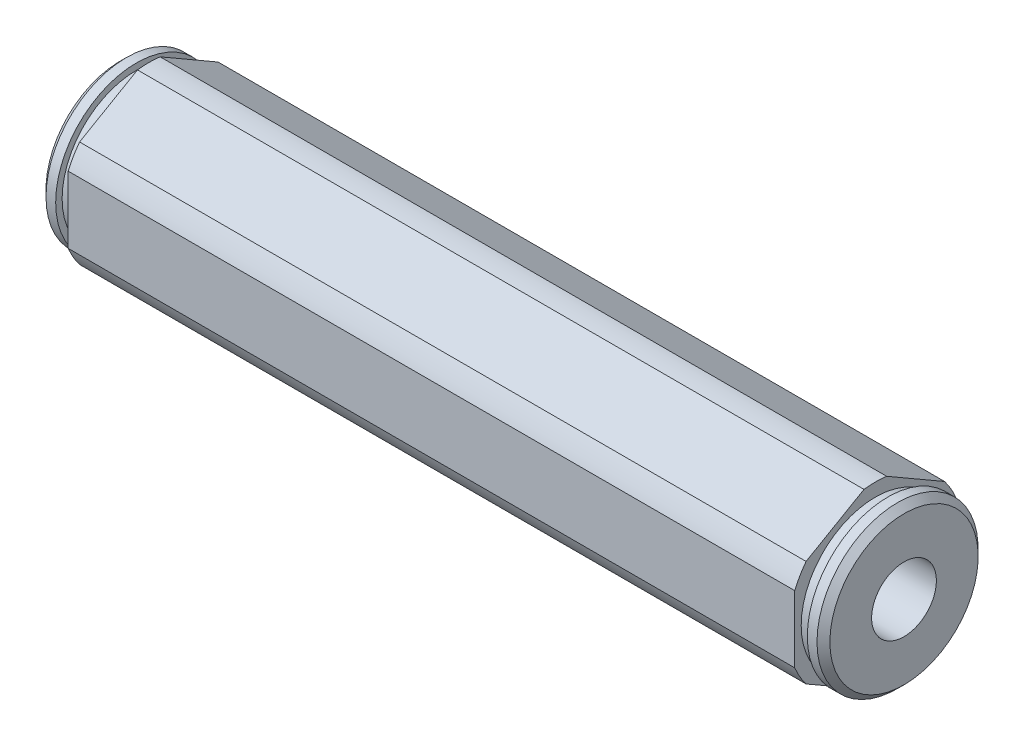
ISO-10303-21;
HEADER;
FILE_DESCRIPTION(('STEP AP214'),'2;1');
FILE_NAME('part.step','',(''),(''),'','','');
FILE_SCHEMA(('AUTOMOTIVE_DESIGN { 1 0 10303 214 1 1 1 1 }'));
ENDSEC;
DATA;
#1=APPLICATION_CONTEXT('core data for automotive mechanical design processes');
#2=APPLICATION_PROTOCOL_DEFINITION('international standard','automotive_design',2000,#1);
#3=PRODUCT_CONTEXT('',#1,'mechanical');
#4=PRODUCT('Part','Part','',(#3));
#5=PRODUCT_RELATED_PRODUCT_CATEGORY('part','',(#4));
#6=PRODUCT_DEFINITION_FORMATION('','',#4);
#7=PRODUCT_DEFINITION_CONTEXT('part definition',#1,'design');
#8=PRODUCT_DEFINITION('design','',#6,#7);
#9=PRODUCT_DEFINITION_SHAPE('','',#8);
#10=(LENGTH_UNIT() NAMED_UNIT(*) SI_UNIT(.MILLI.,.METRE.));
#11=(NAMED_UNIT(*) PLANE_ANGLE_UNIT() SI_UNIT($,.RADIAN.));
#12=(NAMED_UNIT(*) SI_UNIT($,.STERADIAN.) SOLID_ANGLE_UNIT());
#13=UNCERTAINTY_MEASURE_WITH_UNIT(LENGTH_MEASURE(1.E-05),#10,'distance_accuracy_value','');
#14=(GEOMETRIC_REPRESENTATION_CONTEXT(3) GLOBAL_UNCERTAINTY_ASSIGNED_CONTEXT((#13)) GLOBAL_UNIT_ASSIGNED_CONTEXT((#10,
#11,#12)) REPRESENTATION_CONTEXT('',''));
#15=CARTESIAN_POINT('',(0.,0.,0.));
#16=DIRECTION('',(0.,0.,1.));
#17=DIRECTION('',(1.,0.,0.));
#18=AXIS2_PLACEMENT_3D('',#15,#16,#17);
#19=CARTESIAN_POINT('',(2.2606,0.,-5.84199999999999));
#20=DIRECTION('',(1.,0.,0.));
#21=DIRECTION('',(0.,0.,-1.));
#22=AXIS2_PLACEMENT_3D('',#19,#20,#21);
#23=PLANE('',#22);
#24=CARTESIAN_POINT('',(2.2606,0.,0.));
#25=DIRECTION('',(-1.,0.,0.));
#26=DIRECTION('',(0.,0.,1.));
#27=AXIS2_PLACEMENT_3D('',#24,#25,#26);
#28=CIRCLE('',#27,5.84199999999999);
#29=CARTESIAN_POINT('',(2.2606,0.,5.84199999999999));
#30=VERTEX_POINT('',#29);
#31=EDGE_CURVE('E227',#30,#30,#28,.T.);
#32=ORIENTED_EDGE('',*,*,#31,.F.);
#33=EDGE_LOOP('',(#32));
#34=FACE_BOUND('',#33,.T.);
#35=DIRECTION('',(0.,1.,0.));
#36=VECTOR('',#35,1.);
#37=CARTESIAN_POINT('',(2.2606,-2.63498102459961,-6.35));
#38=LINE('',#37,#36);
#39=CARTESIAN_POINT('',(2.2606,-2.63498102459961,-6.35));
#40=VERTEX_POINT('',#39);
#41=CARTESIAN_POINT('',(2.2606,2.63498102459961,-6.35));
#42=VERTEX_POINT('',#41);
#43=EDGE_CURVE('E183',#40,#42,#38,.T.);
#44=ORIENTED_EDGE('',*,*,#43,.F.);
#45=CARTESIAN_POINT('',(2.2606,0.,0.));
#46=DIRECTION('',(1.,0.,0.));
#47=DIRECTION('',(0.,0.,-1.));
#48=AXIS2_PLACEMENT_3D('',#45,#46,#47);
#49=CIRCLE('',#48,6.875);
#50=CARTESIAN_POINT('',(2.2606,-4.18177080173138,-5.45696050579321));
#51=VERTEX_POINT('',#50);
#52=EDGE_CURVE('E185',#51,#40,#49,.T.);
#53=ORIENTED_EDGE('',*,*,#52,.F.);
#54=DIRECTION('',(0.,0.5,-0.866025403784439));
#55=VECTOR('',#54,1.);
#56=CARTESIAN_POINT('',(2.2606,-6.81675182633099,-0.893039494206794));
#57=LINE('',#56,#55);
#58=CARTESIAN_POINT('',(2.2606,-6.81675182633099,-0.89303949420679));
#59=VERTEX_POINT('',#58);
#60=EDGE_CURVE('E216',#59,#51,#57,.T.);
#61=ORIENTED_EDGE('',*,*,#60,.F.);
#62=CARTESIAN_POINT('',(2.2606,0.,0.));
#63=DIRECTION('',(1.,0.,0.));
#64=DIRECTION('',(0.,0.,-1.));
#65=AXIS2_PLACEMENT_3D('',#62,#63,#64);
#66=CIRCLE('',#65,6.875);
#67=CARTESIAN_POINT('',(2.2606,-6.81675182633099,0.89303949420679));
#68=VERTEX_POINT('',#67);
#69=EDGE_CURVE('E166',#68,#59,#66,.T.);
#70=ORIENTED_EDGE('',*,*,#69,.F.);
#71=DIRECTION('',(0.,-0.5,-0.866025403784439));
#72=VECTOR('',#71,1.);
#73=CARTESIAN_POINT('',(2.2606,-4.18177080173138,5.45696050579321));
#74=LINE('',#73,#72);
#75=CARTESIAN_POINT('',(2.2606,-4.18177080173138,5.45696050579321));
#76=VERTEX_POINT('',#75);
#77=EDGE_CURVE('E139',#76,#68,#74,.T.);
#78=ORIENTED_EDGE('',*,*,#77,.F.);
#79=CARTESIAN_POINT('',(2.2606,0.,0.));
#80=DIRECTION('',(1.,0.,0.));
#81=DIRECTION('',(0.,0.,-1.));
#82=AXIS2_PLACEMENT_3D('',#79,#80,#81);
#83=CIRCLE('',#82,6.875);
#84=CARTESIAN_POINT('',(2.2606,-2.63498102459961,6.35));
#85=VERTEX_POINT('',#84);
#86=EDGE_CURVE('E169',#85,#76,#83,.T.);
#87=ORIENTED_EDGE('',*,*,#86,.F.);
#88=DIRECTION('',(0.,-1.,0.));
#89=VECTOR('',#88,1.);
#90=CARTESIAN_POINT('',(2.2606,2.63498102459961,6.35));
#91=LINE('',#90,#89);
#92=CARTESIAN_POINT('',(2.2606,2.63498102459961,6.35));
#93=VERTEX_POINT('',#92);
#94=EDGE_CURVE('E171',#93,#85,#91,.T.);
#95=ORIENTED_EDGE('',*,*,#94,.F.);
#96=CARTESIAN_POINT('',(2.2606,0.,0.));
#97=DIRECTION('',(1.,0.,0.));
#98=DIRECTION('',(0.,0.,-1.));
#99=AXIS2_PLACEMENT_3D('',#96,#97,#98);
#100=CIRCLE('',#99,6.875);
#101=CARTESIAN_POINT('',(2.2606,4.18177080173138,5.45696050579321));
#102=VERTEX_POINT('',#101);
#103=EDGE_CURVE('E173',#102,#93,#100,.T.);
#104=ORIENTED_EDGE('',*,*,#103,.F.);
#105=DIRECTION('',(0.,-0.5,0.866025403784439));
#106=VECTOR('',#105,1.);
#107=CARTESIAN_POINT('',(2.2606,6.81675182633099,0.893039494206793));
#108=LINE('',#107,#106);
#109=CARTESIAN_POINT('',(2.2606,6.81675182633099,0.893039494206793));
#110=VERTEX_POINT('',#109);
#111=EDGE_CURVE('E175',#110,#102,#108,.T.);
#112=ORIENTED_EDGE('',*,*,#111,.F.);
#113=CARTESIAN_POINT('',(2.2606,0.,0.));
#114=DIRECTION('',(1.,0.,0.));
#115=DIRECTION('',(0.,0.,-1.));
#116=AXIS2_PLACEMENT_3D('',#113,#114,#115);
#117=CIRCLE('',#116,6.875);
#118=CARTESIAN_POINT('',(2.2606,6.81675182633099,-0.893039494206794));
#119=VERTEX_POINT('',#118);
#120=EDGE_CURVE('E177',#119,#110,#117,.T.);
#121=ORIENTED_EDGE('',*,*,#120,.F.);
#122=DIRECTION('',(0.,0.5,0.866025403784439));
#123=VECTOR('',#122,1.);
#124=CARTESIAN_POINT('',(2.2606,4.18177080173139,-5.4569605057932));
#125=LINE('',#124,#123);
#126=CARTESIAN_POINT('',(2.2606,4.18177080173139,-5.4569605057932));
#127=VERTEX_POINT('',#126);
#128=EDGE_CURVE('E179',#127,#119,#125,.T.);
#129=ORIENTED_EDGE('',*,*,#128,.F.);
#130=CARTESIAN_POINT('',(2.2606,0.,0.));
#131=DIRECTION('',(1.,0.,0.));
#132=DIRECTION('',(0.,0.,-1.));
#133=AXIS2_PLACEMENT_3D('',#130,#131,#132);
#134=CIRCLE('',#133,6.875);
#135=EDGE_CURVE('E181',#42,#127,#134,.T.);
#136=ORIENTED_EDGE('',*,*,#135,.F.);
#137=EDGE_LOOP('',(#44,#53,#61,#70,#78,#87,#95,#104,#112,#121,#129,#136));
#138=FACE_BOUND('',#137,.T.);
#139=ADVANCED_FACE('F35',(#34,#138),#23,.F.);
#140=CARTESIAN_POINT('',(0.,0.,0.));
#141=DIRECTION('',(1.,0.,0.));
#142=DIRECTION('',(0.,0.,-1.));
#143=AXIS2_PLACEMENT_3D('',#140,#141,#142);
#144=PLANE('',#143);
#145=CARTESIAN_POINT('',(0.,0.,0.));
#146=DIRECTION('',(1.,0.,0.));
#147=DIRECTION('',(0.,0.,-1.));
#148=AXIS2_PLACEMENT_3D('',#145,#146,#147);
#149=CIRCLE('',#148,5.84199999999998);
#150=CARTESIAN_POINT('',(0.,0.,-5.84199999999998));
#151=VERTEX_POINT('',#150);
#152=EDGE_CURVE('E236',#151,#151,#149,.F.);
#153=ORIENTED_EDGE('',*,*,#152,.T.);
#154=EDGE_LOOP('',(#153));
#155=FACE_BOUND('',#154,.T.);
#156=CARTESIAN_POINT('',(0.,0.,0.));
#157=DIRECTION('',(1.,0.,0.));
#158=DIRECTION('',(0.,0.,-1.));
#159=AXIS2_PLACEMENT_3D('',#156,#157,#158);
#160=CIRCLE('',#159,2.5527);
#161=CARTESIAN_POINT('',(0.,0.,-2.55269999999999));
#162=VERTEX_POINT('',#161);
#163=EDGE_CURVE('E132',#162,#162,#160,.F.);
#164=ORIENTED_EDGE('',*,*,#163,.F.);
#165=EDGE_LOOP('',(#164));
#166=FACE_BOUND('',#165,.T.);
#167=ADVANCED_FACE('F257',(#155,#166),#144,.F.);
#168=CARTESIAN_POINT('',(0.,0.,0.));
#169=DIRECTION('',(-1.,0.,0.));
#170=DIRECTION('',(0.,0.,1.));
#171=AXIS2_PLACEMENT_3D('',#168,#169,#170);
#172=CYLINDRICAL_SURFACE('',#171,6.35);
#173=CARTESIAN_POINT('',(0.508000000000021,0.,0.));
#174=DIRECTION('',(1.,0.,0.));
#175=DIRECTION('',(0.,0.,-1.));
#176=AXIS2_PLACEMENT_3D('',#173,#174,#175);
#177=CIRCLE('',#176,6.35);
#178=CARTESIAN_POINT('',(0.508000000000021,0.,-6.35));
#179=VERTEX_POINT('',#178);
#180=EDGE_CURVE('E239',#179,#179,#177,.T.);
#181=ORIENTED_EDGE('',*,*,#180,.T.);
#182=EDGE_LOOP('',(#181));
#183=FACE_BOUND('',#182,.T.);
#184=CARTESIAN_POINT('',(1.27,0.,0.));
#185=DIRECTION('',(-1.,0.,0.));
#186=DIRECTION('',(0.,0.,1.));
#187=AXIS2_PLACEMENT_3D('',#184,#185,#186);
#188=CIRCLE('',#187,6.35);
#189=CARTESIAN_POINT('',(1.27,0.,6.35));
#190=VERTEX_POINT('',#189);
#191=EDGE_CURVE('E233',#190,#190,#188,.T.);
#192=ORIENTED_EDGE('',*,*,#191,.T.);
#193=EDGE_LOOP('',(#192));
#194=FACE_BOUND('',#193,.T.);
#195=ADVANCED_FACE('F263',(#183,#194),#172,.T.);
#196=CARTESIAN_POINT('',(1.27,0.,-6.35));
#197=DIRECTION('',(-1.,0.,0.));
#198=DIRECTION('',(0.,0.,1.));
#199=AXIS2_PLACEMENT_3D('',#196,#197,#198);
#200=PLANE('',#199);
#201=ORIENTED_EDGE('',*,*,#191,.F.);
#202=EDGE_LOOP('',(#201));
#203=FACE_BOUND('',#202,.T.);
#204=CARTESIAN_POINT('',(1.27,0.,0.));
#205=DIRECTION('',(-1.,0.,0.));
#206=DIRECTION('',(0.,0.,1.));
#207=AXIS2_PLACEMENT_3D('',#204,#205,#206);
#208=CIRCLE('',#207,5.84199999999999);
#209=CARTESIAN_POINT('',(1.27,0.,5.84199999999999));
#210=VERTEX_POINT('',#209);
#211=EDGE_CURVE('E230',#210,#210,#208,.T.);
#212=ORIENTED_EDGE('',*,*,#211,.T.);
#213=EDGE_LOOP('',(#212));
#214=FACE_BOUND('',#213,.T.);
#215=ADVANCED_FACE('F275',(#203,#214),#200,.F.);
#216=CARTESIAN_POINT('',(0.,0.,0.));
#217=DIRECTION('',(-1.,0.,0.));
#218=DIRECTION('',(0.,0.,1.));
#219=AXIS2_PLACEMENT_3D('',#216,#217,#218);
#220=CYLINDRICAL_SURFACE('',#219,5.84199999999999);
#221=ORIENTED_EDGE('',*,*,#211,.F.);
#222=EDGE_LOOP('',(#221));
#223=FACE_BOUND('',#222,.T.);
#224=ORIENTED_EDGE('',*,*,#31,.T.);
#225=EDGE_LOOP('',(#224));
#226=FACE_BOUND('',#225,.T.);
#227=ADVANCED_FACE('F271',(#223,#226),#220,.T.);
#228=CARTESIAN_POINT('',(61.7738,0.,0.));
#229=DIRECTION('',(-1.,0.,0.));
#230=DIRECTION('',(0.,0.,1.));
#231=AXIS2_PLACEMENT_3D('',#228,#229,#230);
#232=CYLINDRICAL_SURFACE('',#231,6.875);
#233=DIRECTION('',(-1.,0.,0.));
#234=VECTOR('',#233,1.);
#235=CARTESIAN_POINT('',(61.7738,-4.18177080173138,-5.45696050579321));
#236=LINE('',#235,#234);
#237=CARTESIAN_POINT('',(59.5122,-4.18177080173138,-5.45696050579321));
#238=VERTEX_POINT('',#237);
#239=EDGE_CURVE('E55',#238,#51,#236,.T.);
#240=ORIENTED_EDGE('',*,*,#239,.T.);
#241=ORIENTED_EDGE('',*,*,#52,.T.);
#242=DIRECTION('',(-1.,0.,0.));
#243=VECTOR('',#242,1.);
#244=CARTESIAN_POINT('',(61.7738,-2.63498102459961,-6.35));
#245=LINE('',#244,#243);
#246=CARTESIAN_POINT('',(59.5122,-2.63498102459961,-6.35));
#247=VERTEX_POINT('',#246);
#248=EDGE_CURVE('E211',#247,#40,#245,.T.);
#249=ORIENTED_EDGE('',*,*,#248,.F.);
#250=CARTESIAN_POINT('',(59.5122,0.,0.));
#251=DIRECTION('',(-1.,0.,0.));
#252=DIRECTION('',(0.,0.,1.));
#253=AXIS2_PLACEMENT_3D('',#250,#251,#252);
#254=CIRCLE('',#253,6.875);
#255=EDGE_CURVE('E164',#247,#238,#254,.T.);
#256=ORIENTED_EDGE('',*,*,#255,.T.);
#257=EDGE_LOOP('',(#240,#241,#249,#256));
#258=FACE_BOUND('',#257,.T.);
#259=ADVANCED_FACE('F274',(#258),#232,.T.);
#260=CARTESIAN_POINT('',(61.7738,-2.63498102459961,-6.35));
#261=DIRECTION('',(0.,0.,1.));
#262=DIRECTION('',(0.,-1.,0.));
#263=AXIS2_PLACEMENT_3D('',#260,#261,#262);
#264=PLANE('',#263);
#265=ORIENTED_EDGE('',*,*,#248,.T.);
#266=ORIENTED_EDGE('',*,*,#43,.T.);
#267=DIRECTION('',(-1.,0.,0.));
#268=VECTOR('',#267,1.);
#269=CARTESIAN_POINT('',(61.7738,2.63498102459961,-6.35));
#270=LINE('',#269,#268);
#271=CARTESIAN_POINT('',(59.5122,2.63498102459961,-6.35));
#272=VERTEX_POINT('',#271);
#273=EDGE_CURVE('E208',#272,#42,#270,.T.);
#274=ORIENTED_EDGE('',*,*,#273,.F.);
#275=DIRECTION('',(0.,-1.,0.));
#276=VECTOR('',#275,1.);
#277=CARTESIAN_POINT('',(59.5122,-2.63498102459961,-6.35));
#278=LINE('',#277,#276);
#279=EDGE_CURVE('E162',#272,#247,#278,.T.);
#280=ORIENTED_EDGE('',*,*,#279,.T.);
#281=EDGE_LOOP('',(#265,#266,#274,#280));
#282=FACE_BOUND('',#281,.T.);
#283=ADVANCED_FACE('F368',(#282),#264,.F.);
#284=CARTESIAN_POINT('',(61.7738,0.,0.));
#285=DIRECTION('',(-1.,0.,0.));
#286=DIRECTION('',(0.,0.,1.));
#287=AXIS2_PLACEMENT_3D('',#284,#285,#286);
#288=CYLINDRICAL_SURFACE('',#287,6.875);
#289=ORIENTED_EDGE('',*,*,#273,.T.);
#290=ORIENTED_EDGE('',*,*,#135,.T.);
#291=DIRECTION('',(-1.,0.,0.));
#292=VECTOR('',#291,1.);
#293=CARTESIAN_POINT('',(61.7738,4.18177080173139,-5.4569605057932));
#294=LINE('',#293,#292);
#295=CARTESIAN_POINT('',(59.5122,4.18177080173139,-5.4569605057932));
#296=VERTEX_POINT('',#295);
#297=EDGE_CURVE('E205',#296,#127,#294,.T.);
#298=ORIENTED_EDGE('',*,*,#297,.F.);
#299=CARTESIAN_POINT('',(59.5122,0.,0.));
#300=DIRECTION('',(-1.,0.,0.));
#301=DIRECTION('',(0.,0.,1.));
#302=AXIS2_PLACEMENT_3D('',#299,#300,#301);
#303=CIRCLE('',#302,6.875);
#304=EDGE_CURVE('E160',#296,#272,#303,.T.);
#305=ORIENTED_EDGE('',*,*,#304,.T.);
#306=EDGE_LOOP('',(#289,#290,#298,#305));
#307=FACE_BOUND('',#306,.T.);
#308=ADVANCED_FACE('F365',(#307),#288,.T.);
#309=CARTESIAN_POINT('',(61.7738,4.18177080173139,-5.4569605057932));
#310=DIRECTION('',(0.,-0.866025403784439,0.5));
#311=DIRECTION('',(0.,-0.5,-0.866025403784439));
#312=AXIS2_PLACEMENT_3D('',#309,#310,#311);
#313=PLANE('',#312);
#314=ORIENTED_EDGE('',*,*,#297,.T.);
#315=ORIENTED_EDGE('',*,*,#128,.T.);
#316=DIRECTION('',(-1.,0.,0.));
#317=VECTOR('',#316,1.);
#318=CARTESIAN_POINT('',(61.7738,6.81675182633099,-0.893039494206794));
#319=LINE('',#318,#317);
#320=CARTESIAN_POINT('',(59.5122,6.81675182633099,-0.893039494206794));
#321=VERTEX_POINT('',#320);
#322=EDGE_CURVE('E202',#321,#119,#319,.T.);
#323=ORIENTED_EDGE('',*,*,#322,.F.);
#324=DIRECTION('',(0.,-0.5,-0.866025403784439));
#325=VECTOR('',#324,1.);
#326=CARTESIAN_POINT('',(59.5122,4.18177080173139,-5.4569605057932));
#327=LINE('',#326,#325);
#328=EDGE_CURVE('E158',#321,#296,#327,.T.);
#329=ORIENTED_EDGE('',*,*,#328,.T.);
#330=EDGE_LOOP('',(#314,#315,#323,#329));
#331=FACE_BOUND('',#330,.T.);
#332=ADVANCED_FACE('F361',(#331),#313,.F.);
#333=CARTESIAN_POINT('',(61.7738,0.,0.));
#334=DIRECTION('',(-1.,0.,0.));
#335=DIRECTION('',(0.,0.,1.));
#336=AXIS2_PLACEMENT_3D('',#333,#334,#335);
#337=CYLINDRICAL_SURFACE('',#336,6.875);
#338=ORIENTED_EDGE('',*,*,#322,.T.);
#339=ORIENTED_EDGE('',*,*,#120,.T.);
#340=DIRECTION('',(-1.,0.,0.));
#341=VECTOR('',#340,1.);
#342=CARTESIAN_POINT('',(61.7738,6.81675182633099,0.893039494206793));
#343=LINE('',#342,#341);
#344=CARTESIAN_POINT('',(59.5122,6.81675182633099,0.893039494206793));
#345=VERTEX_POINT('',#344);
#346=EDGE_CURVE('E199',#345,#110,#343,.T.);
#347=ORIENTED_EDGE('',*,*,#346,.F.);
#348=CARTESIAN_POINT('',(59.5122,0.,0.));
#349=DIRECTION('',(-1.,0.,0.));
#350=DIRECTION('',(0.,0.,1.));
#351=AXIS2_PLACEMENT_3D('',#348,#349,#350);
#352=CIRCLE('',#351,6.875);
#353=EDGE_CURVE('E156',#345,#321,#352,.T.);
#354=ORIENTED_EDGE('',*,*,#353,.T.);
#355=EDGE_LOOP('',(#338,#339,#347,#354));
#356=FACE_BOUND('',#355,.T.);
#357=ADVANCED_FACE('F357',(#356),#337,.T.);
#358=CARTESIAN_POINT('',(61.7738,6.81675182633099,0.893039494206793));
#359=DIRECTION('',(0.,-0.866025403784438,-0.5));
#360=DIRECTION('',(0.,0.5,-0.866025403784439));
#361=AXIS2_PLACEMENT_3D('',#358,#359,#360);
#362=PLANE('',#361);
#363=ORIENTED_EDGE('',*,*,#346,.T.);
#364=ORIENTED_EDGE('',*,*,#111,.T.);
#365=DIRECTION('',(-1.,0.,0.));
#366=VECTOR('',#365,1.);
#367=CARTESIAN_POINT('',(61.7738,4.18177080173138,5.45696050579321));
#368=LINE('',#367,#366);
#369=CARTESIAN_POINT('',(59.5122,4.18177080173138,5.45696050579321));
#370=VERTEX_POINT('',#369);
#371=EDGE_CURVE('E196',#370,#102,#368,.T.);
#372=ORIENTED_EDGE('',*,*,#371,.F.);
#373=DIRECTION('',(0.,0.5,-0.866025403784439));
#374=VECTOR('',#373,1.);
#375=CARTESIAN_POINT('',(59.5122,6.81675182633099,0.893039494206793));
#376=LINE('',#375,#374);
#377=EDGE_CURVE('E154',#370,#345,#376,.T.);
#378=ORIENTED_EDGE('',*,*,#377,.T.);
#379=EDGE_LOOP('',(#363,#364,#372,#378));
#380=FACE_BOUND('',#379,.T.);
#381=ADVANCED_FACE('F353',(#380),#362,.F.);
#382=CARTESIAN_POINT('',(61.7738,0.,0.));
#383=DIRECTION('',(-1.,0.,0.));
#384=DIRECTION('',(0.,0.,1.));
#385=AXIS2_PLACEMENT_3D('',#382,#383,#384);
#386=CYLINDRICAL_SURFACE('',#385,6.875);
#387=ORIENTED_EDGE('',*,*,#371,.T.);
#388=ORIENTED_EDGE('',*,*,#103,.T.);
#389=DIRECTION('',(-1.,0.,0.));
#390=VECTOR('',#389,1.);
#391=CARTESIAN_POINT('',(61.7738,2.63498102459961,6.35));
#392=LINE('',#391,#390);
#393=CARTESIAN_POINT('',(59.5122,2.63498102459961,6.35));
#394=VERTEX_POINT('',#393);
#395=EDGE_CURVE('E193',#394,#93,#392,.T.);
#396=ORIENTED_EDGE('',*,*,#395,.F.);
#397=CARTESIAN_POINT('',(59.5122,0.,0.));
#398=DIRECTION('',(-1.,0.,0.));
#399=DIRECTION('',(0.,0.,1.));
#400=AXIS2_PLACEMENT_3D('',#397,#398,#399);
#401=CIRCLE('',#400,6.875);
#402=EDGE_CURVE('E152',#394,#370,#401,.T.);
#403=ORIENTED_EDGE('',*,*,#402,.T.);
#404=EDGE_LOOP('',(#387,#388,#396,#403));
#405=FACE_BOUND('',#404,.T.);
#406=ADVANCED_FACE('F349',(#405),#386,.T.);
#407=CARTESIAN_POINT('',(61.7738,2.63498102459961,6.35));
#408=DIRECTION('',(0.,0.,-1.));
#409=DIRECTION('',(0.,1.,0.));
#410=AXIS2_PLACEMENT_3D('',#407,#408,#409);
#411=PLANE('',#410);
#412=ORIENTED_EDGE('',*,*,#395,.T.);
#413=ORIENTED_EDGE('',*,*,#94,.T.);
#414=DIRECTION('',(-1.,0.,0.));
#415=VECTOR('',#414,1.);
#416=CARTESIAN_POINT('',(61.7738,-2.63498102459961,6.35));
#417=LINE('',#416,#415);
#418=CARTESIAN_POINT('',(59.5122,-2.63498102459961,6.35));
#419=VERTEX_POINT('',#418);
#420=EDGE_CURVE('E190',#419,#85,#417,.T.);
#421=ORIENTED_EDGE('',*,*,#420,.F.);
#422=DIRECTION('',(0.,1.,0.));
#423=VECTOR('',#422,1.);
#424=CARTESIAN_POINT('',(59.5122,2.63498102459961,6.35));
#425=LINE('',#424,#423);
#426=EDGE_CURVE('E147',#419,#394,#425,.T.);
#427=ORIENTED_EDGE('',*,*,#426,.T.);
#428=EDGE_LOOP('',(#412,#413,#421,#427));
#429=FACE_BOUND('',#428,.T.);
#430=ADVANCED_FACE('F345',(#429),#411,.F.);
#431=CARTESIAN_POINT('',(61.7738,0.,0.));
#432=DIRECTION('',(-1.,0.,0.));
#433=DIRECTION('',(0.,0.,1.));
#434=AXIS2_PLACEMENT_3D('',#431,#432,#433);
#435=CYLINDRICAL_SURFACE('',#434,6.875);
#436=ORIENTED_EDGE('',*,*,#420,.T.);
#437=ORIENTED_EDGE('',*,*,#86,.T.);
#438=DIRECTION('',(-1.,0.,0.));
#439=VECTOR('',#438,1.);
#440=CARTESIAN_POINT('',(61.7738,-4.18177080173138,5.45696050579321));
#441=LINE('',#440,#439);
#442=CARTESIAN_POINT('',(59.5122,-4.18177080173138,5.45696050579321));
#443=VERTEX_POINT('',#442);
#444=EDGE_CURVE('E140',#443,#76,#441,.T.);
#445=ORIENTED_EDGE('',*,*,#444,.F.);
#446=CARTESIAN_POINT('',(59.5122,0.,0.));
#447=DIRECTION('',(-1.,0.,0.));
#448=DIRECTION('',(0.,0.,1.));
#449=AXIS2_PLACEMENT_3D('',#446,#447,#448);
#450=CIRCLE('',#449,6.875);
#451=EDGE_CURVE('E145',#443,#419,#450,.T.);
#452=ORIENTED_EDGE('',*,*,#451,.T.);
#453=EDGE_LOOP('',(#436,#437,#445,#452));
#454=FACE_BOUND('',#453,.T.);
#455=ADVANCED_FACE('F342',(#454),#435,.T.);
#456=CARTESIAN_POINT('',(61.7738,-4.18177080173138,5.45696050579321));
#457=DIRECTION('',(0.,0.866025403784439,-0.5));
#458=DIRECTION('',(0.,0.5,0.866025403784439));
#459=AXIS2_PLACEMENT_3D('',#456,#457,#458);
#460=PLANE('',#459);
#461=ORIENTED_EDGE('',*,*,#444,.T.);
#462=ORIENTED_EDGE('',*,*,#77,.T.);
#463=DIRECTION('',(-1.,0.,0.));
#464=VECTOR('',#463,1.);
#465=CARTESIAN_POINT('',(61.7738,-6.81675182633099,0.89303949420679));
#466=LINE('',#465,#464);
#467=CARTESIAN_POINT('',(59.5122,-6.81675182633099,0.89303949420679));
#468=VERTEX_POINT('',#467);
#469=EDGE_CURVE('E126',#468,#68,#466,.T.);
#470=ORIENTED_EDGE('',*,*,#469,.F.);
#471=DIRECTION('',(0.,0.5,0.866025403784439));
#472=VECTOR('',#471,1.);
#473=CARTESIAN_POINT('',(59.5122,-4.18177080173138,5.45696050579321));
#474=LINE('',#473,#472);
#475=EDGE_CURVE('E131',#468,#443,#474,.T.);
#476=ORIENTED_EDGE('',*,*,#475,.T.);
#477=EDGE_LOOP('',(#461,#462,#470,#476));
#478=FACE_BOUND('',#477,.T.);
#479=ADVANCED_FACE('F136',(#478),#460,.F.);
#480=CARTESIAN_POINT('',(61.7738,0.,0.));
#481=DIRECTION('',(-1.,0.,0.));
#482=DIRECTION('',(0.,0.,1.));
#483=AXIS2_PLACEMENT_3D('',#480,#481,#482);
#484=CYLINDRICAL_SURFACE('',#483,6.875);
#485=ORIENTED_EDGE('',*,*,#469,.T.);
#486=ORIENTED_EDGE('',*,*,#69,.T.);
#487=DIRECTION('',(-1.,0.,0.));
#488=VECTOR('',#487,1.);
#489=CARTESIAN_POINT('',(61.7738,-6.81675182633099,-0.893039494206791));
#490=LINE('',#489,#488);
#491=CARTESIAN_POINT('',(59.5122,-6.81675182633099,-0.893039494206791));
#492=VERTEX_POINT('',#491);
#493=EDGE_CURVE('E50',#492,#59,#490,.T.);
#494=ORIENTED_EDGE('',*,*,#493,.F.);
#495=CARTESIAN_POINT('',(59.5122,0.,0.));
#496=DIRECTION('',(-1.,0.,0.));
#497=DIRECTION('',(0.,0.,1.));
#498=AXIS2_PLACEMENT_3D('',#495,#496,#497);
#499=CIRCLE('',#498,6.875);
#500=EDGE_CURVE('E123',#492,#468,#499,.T.);
#501=ORIENTED_EDGE('',*,*,#500,.T.);
#502=EDGE_LOOP('',(#485,#486,#494,#501));
#503=FACE_BOUND('',#502,.T.);
#504=ADVANCED_FACE('F125',(#503),#484,.T.);
#505=CARTESIAN_POINT('',(61.7738,-6.81675182633099,-0.893039494206794));
#506=DIRECTION('',(0.,0.866025403784439,0.5));
#507=DIRECTION('',(0.,-0.5,0.866025403784439));
#508=AXIS2_PLACEMENT_3D('',#505,#506,#507);
#509=PLANE('',#508);
#510=ORIENTED_EDGE('',*,*,#493,.T.);
#511=ORIENTED_EDGE('',*,*,#60,.T.);
#512=ORIENTED_EDGE('',*,*,#239,.F.);
#513=DIRECTION('',(0.,-0.5,0.866025403784439));
#514=VECTOR('',#513,1.);
#515=CARTESIAN_POINT('',(59.5122,-6.81675182633099,-0.893039494206794));
#516=LINE('',#515,#514);
#517=EDGE_CURVE('E214',#238,#492,#516,.T.);
#518=ORIENTED_EDGE('',*,*,#517,.T.);
#519=EDGE_LOOP('',(#510,#511,#512,#518));
#520=FACE_BOUND('',#519,.T.);
#521=ADVANCED_FACE('F304',(#520),#509,.F.);
#522=CARTESIAN_POINT('',(61.7728,0.,0.));
#523=DIRECTION('',(-1.,0.,0.));
#524=DIRECTION('',(0.,0.,1.));
#525=AXIS2_PLACEMENT_3D('',#522,#523,#524);
#526=PLANE('',#525);
#527=CARTESIAN_POINT('',(61.7728,0.,0.));
#528=DIRECTION('',(-1.,0.,0.));
#529=DIRECTION('',(0.,0.,1.));
#530=AXIS2_PLACEMENT_3D('',#527,#528,#529);
#531=CIRCLE('',#530,5.84199999999999);
#532=CARTESIAN_POINT('',(61.7728,0.,5.84199999999999));
#533=VERTEX_POINT('',#532);
#534=EDGE_CURVE('E11',#533,#533,#531,.F.);
#535=ORIENTED_EDGE('',*,*,#534,.T.);
#536=EDGE_LOOP('',(#535));
#537=FACE_BOUND('',#536,.T.);
#538=CARTESIAN_POINT('',(61.7728,0.,0.));
#539=DIRECTION('',(1.,0.,0.));
#540=DIRECTION('',(0.,0.,-1.));
#541=AXIS2_PLACEMENT_3D('',#538,#539,#540);
#542=CIRCLE('',#541,2.5527);
#543=CARTESIAN_POINT('',(61.7728,0.,-2.5527));
#544=VERTEX_POINT('',#543);
#545=EDGE_CURVE('E296',#544,#544,#542,.T.);
#546=ORIENTED_EDGE('',*,*,#545,.F.);
#547=EDGE_LOOP('',(#546));
#548=FACE_BOUND('',#547,.T.);
#549=ADVANCED_FACE('F302',(#537,#548),#526,.F.);
#550=CARTESIAN_POINT('',(0.,0.,0.));
#551=DIRECTION('',(-1.,0.,0.));
#552=DIRECTION('',(0.,0.,1.));
#553=AXIS2_PLACEMENT_3D('',#550,#551,#552);
#554=CYLINDRICAL_SURFACE('',#553,6.35);
#555=CARTESIAN_POINT('',(61.2648,0.,0.));
#556=DIRECTION('',(-1.,0.,0.));
#557=DIRECTION('',(0.,0.,1.));
#558=AXIS2_PLACEMENT_3D('',#555,#556,#557);
#559=CIRCLE('',#558,6.35);
#560=CARTESIAN_POINT('',(61.2648,0.,6.35));
#561=VERTEX_POINT('',#560);
#562=EDGE_CURVE('E43',#561,#561,#559,.T.);
#563=ORIENTED_EDGE('',*,*,#562,.T.);
#564=EDGE_LOOP('',(#563));
#565=FACE_BOUND('',#564,.T.);
#566=CARTESIAN_POINT('',(60.5028,0.,0.));
#567=DIRECTION('',(-1.,0.,0.));
#568=DIRECTION('',(0.,0.,1.));
#569=AXIS2_PLACEMENT_3D('',#566,#567,#568);
#570=CIRCLE('',#569,6.35);
#571=CARTESIAN_POINT('',(60.5028,0.,6.35));
#572=VERTEX_POINT('',#571);
#573=EDGE_CURVE('E218',#572,#572,#570,.T.);
#574=ORIENTED_EDGE('',*,*,#573,.F.);
#575=EDGE_LOOP('',(#574));
#576=FACE_BOUND('',#575,.T.);
#577=ADVANCED_FACE('F244',(#565,#576),#554,.T.);
#578=CARTESIAN_POINT('',(60.5028,0.,-6.35));
#579=DIRECTION('',(1.,0.,0.));
#580=DIRECTION('',(0.,0.,-1.));
#581=AXIS2_PLACEMENT_3D('',#578,#579,#580);
#582=PLANE('',#581);
#583=CARTESIAN_POINT('',(60.5028,0.,0.));
#584=DIRECTION('',(-1.,0.,0.));
#585=DIRECTION('',(0.,0.,1.));
#586=AXIS2_PLACEMENT_3D('',#583,#584,#585);
#587=CIRCLE('',#586,5.842);
#588=CARTESIAN_POINT('',(60.5028,0.,5.842));
#589=VERTEX_POINT('',#588);
#590=EDGE_CURVE('E221',#589,#589,#587,.T.);
#591=ORIENTED_EDGE('',*,*,#590,.F.);
#592=EDGE_LOOP('',(#591));
#593=FACE_BOUND('',#592,.T.);
#594=ORIENTED_EDGE('',*,*,#573,.T.);
#595=EDGE_LOOP('',(#594));
#596=FACE_BOUND('',#595,.T.);
#597=ADVANCED_FACE('F311',(#593,#596),#582,.F.);
#598=CARTESIAN_POINT('',(0.,0.,0.));
#599=DIRECTION('',(-1.,0.,0.));
#600=DIRECTION('',(0.,0.,1.));
#601=AXIS2_PLACEMENT_3D('',#598,#599,#600);
#602=CYLINDRICAL_SURFACE('',#601,5.842);
#603=CARTESIAN_POINT('',(59.5122,0.,0.));
#604=DIRECTION('',(-1.,0.,0.));
#605=DIRECTION('',(0.,0.,1.));
#606=AXIS2_PLACEMENT_3D('',#603,#604,#605);
#607=CIRCLE('',#606,5.842);
#608=CARTESIAN_POINT('',(59.5122,0.,5.842));
#609=VERTEX_POINT('',#608);
#610=EDGE_CURVE('E224',#609,#609,#607,.T.);
#611=ORIENTED_EDGE('',*,*,#610,.F.);
#612=EDGE_LOOP('',(#611));
#613=FACE_BOUND('',#612,.T.);
#614=ORIENTED_EDGE('',*,*,#590,.T.);
#615=EDGE_LOOP('',(#614));
#616=FACE_BOUND('',#615,.T.);
#617=ADVANCED_FACE('F318',(#613,#616),#602,.T.);
#618=CARTESIAN_POINT('',(59.5122,0.,-5.842));
#619=DIRECTION('',(-1.,0.,0.));
#620=DIRECTION('',(0.,0.,1.));
#621=AXIS2_PLACEMENT_3D('',#618,#619,#620);
#622=PLANE('',#621);
#623=ORIENTED_EDGE('',*,*,#610,.T.);
#624=EDGE_LOOP('',(#623));
#625=FACE_BOUND('',#624,.T.);
#626=ORIENTED_EDGE('',*,*,#517,.F.);
#627=ORIENTED_EDGE('',*,*,#255,.F.);
#628=ORIENTED_EDGE('',*,*,#279,.F.);
#629=ORIENTED_EDGE('',*,*,#304,.F.);
#630=ORIENTED_EDGE('',*,*,#328,.F.);
#631=ORIENTED_EDGE('',*,*,#353,.F.);
#632=ORIENTED_EDGE('',*,*,#377,.F.);
#633=ORIENTED_EDGE('',*,*,#402,.F.);
#634=ORIENTED_EDGE('',*,*,#426,.F.);
#635=ORIENTED_EDGE('',*,*,#451,.F.);
#636=ORIENTED_EDGE('',*,*,#475,.F.);
#637=ORIENTED_EDGE('',*,*,#500,.F.);
#638=EDGE_LOOP('',(#626,#627,#628,#629,#630,#631,#632,#633,#634,#635,#636,#637));
#639=FACE_BOUND('',#638,.T.);
#640=ADVANCED_FACE('F143',(#625,#639),#622,.F.);
#641=CARTESIAN_POINT('',(-7.2201259213396,0.,0.));
#642=DIRECTION('',(1.,0.,0.));
#643=DIRECTION('',(0.,0.,-1.));
#644=AXIS2_PLACEMENT_3D('',#641,#642,#643);
#645=CYLINDRICAL_SURFACE('',#644,2.5527);
#646=ORIENTED_EDGE('',*,*,#163,.T.);
#647=EDGE_LOOP('',(#646));
#648=FACE_BOUND('',#647,.T.);
#649=ORIENTED_EDGE('',*,*,#545,.T.);
#650=EDGE_LOOP('',(#649));
#651=FACE_BOUND('',#650,.T.);
#652=ADVANCED_FACE('F253',(#648,#651),#645,.F.);
#653=CARTESIAN_POINT('',(0.,0.,0.));
#654=DIRECTION('',(1.,0.,0.));
#655=DIRECTION('',(0.,0.,-1.));
#656=AXIS2_PLACEMENT_3D('',#653,#654,#655);
#657=CONICAL_SURFACE('',#656,5.84199999999998,0.785398163397447);
#658=ORIENTED_EDGE('',*,*,#180,.F.);
#659=EDGE_LOOP('',(#658));
#660=FACE_BOUND('',#659,.T.);
#661=ORIENTED_EDGE('',*,*,#152,.F.);
#662=EDGE_LOOP('',(#661));
#663=FACE_BOUND('',#662,.T.);
#664=ADVANCED_FACE('F248',(#660,#663),#657,.T.);
#665=CARTESIAN_POINT('',(61.2648,0.,0.));
#666=DIRECTION('',(-1.,0.,0.));
#667=DIRECTION('',(0.,0.,1.));
#668=AXIS2_PLACEMENT_3D('',#665,#666,#667);
#669=CONICAL_SURFACE('',#668,6.35,0.78539816339744);
#670=ORIENTED_EDGE('',*,*,#534,.F.);
#671=EDGE_LOOP('',(#670));
#672=FACE_BOUND('',#671,.T.);
#673=ORIENTED_EDGE('',*,*,#562,.F.);
#674=EDGE_LOOP('',(#673));
#675=FACE_BOUND('',#674,.T.);
#676=ADVANCED_FACE('F37',(#672,#675),#669,.T.);
#677=CLOSED_SHELL('',(#139,#167,#195,#215,#227,#259,#283,#308,#332,#357,#381,#406,#430,#455,
#479,#504,#521,#549,#577,#597,#617,#640,#652,#664,#676));
#678=MANIFOLD_SOLID_BREP('B2',#677);
#679=ADVANCED_BREP_SHAPE_REPRESENTATION('',(#18,#678),#14);
#680=SHAPE_DEFINITION_REPRESENTATION(#9,#679);
ENDSEC;
END-ISO-10303-21;
